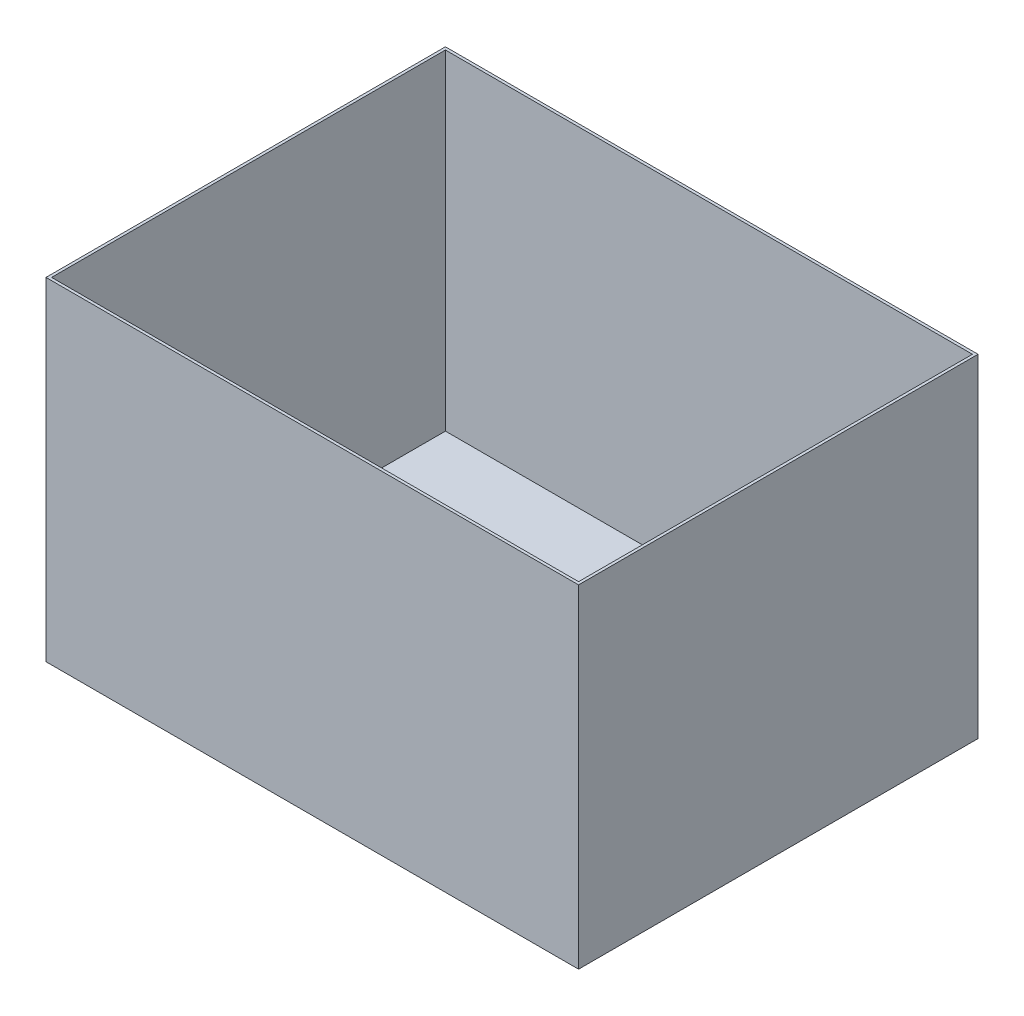
ISO-10303-21;
HEADER;
FILE_DESCRIPTION(('STEP AP214'),'2;1');
FILE_NAME('part.step','',(''),(''),'','','');
FILE_SCHEMA(('AUTOMOTIVE_DESIGN { 1 0 10303 214 1 1 1 1 }'));
ENDSEC;
DATA;
#1=APPLICATION_CONTEXT('core data for automotive mechanical design processes');
#2=APPLICATION_PROTOCOL_DEFINITION('international standard','automotive_design',2000,#1);
#3=PRODUCT_CONTEXT('',#1,'mechanical');
#4=PRODUCT('Part','Part','',(#3));
#5=PRODUCT_RELATED_PRODUCT_CATEGORY('part','',(#4));
#6=PRODUCT_DEFINITION_FORMATION('','',#4);
#7=PRODUCT_DEFINITION_CONTEXT('part definition',#1,'design');
#8=PRODUCT_DEFINITION('design','',#6,#7);
#9=PRODUCT_DEFINITION_SHAPE('','',#8);
#10=(LENGTH_UNIT() NAMED_UNIT(*) SI_UNIT(.MILLI.,.METRE.));
#11=(NAMED_UNIT(*) PLANE_ANGLE_UNIT() SI_UNIT($,.RADIAN.));
#12=(NAMED_UNIT(*) SI_UNIT($,.STERADIAN.) SOLID_ANGLE_UNIT());
#13=UNCERTAINTY_MEASURE_WITH_UNIT(LENGTH_MEASURE(1.E-05),#10,'distance_accuracy_value','');
#14=(GEOMETRIC_REPRESENTATION_CONTEXT(3) GLOBAL_UNCERTAINTY_ASSIGNED_CONTEXT((#13)) GLOBAL_UNIT_ASSIGNED_CONTEXT((#10,
#11,#12)) REPRESENTATION_CONTEXT('',''));
#15=CARTESIAN_POINT('',(0.,0.,0.));
#16=DIRECTION('',(0.,0.,1.));
#17=DIRECTION('',(1.,0.,0.));
#18=AXIS2_PLACEMENT_3D('',#15,#16,#17);
#19=CARTESIAN_POINT('',(609.6,762.,-457.2));
#20=DIRECTION('',(-1.,0.,0.));
#21=DIRECTION('',(0.,0.,1.));
#22=AXIS2_PLACEMENT_3D('',#19,#20,#21);
#23=PLANE('',#22);
#24=DIRECTION('',(0.,0.,-1.));
#25=VECTOR('',#24,1.);
#26=CARTESIAN_POINT('',(609.6,0.,-457.2));
#27=LINE('',#26,#25);
#28=CARTESIAN_POINT('',(609.6,0.,457.2));
#29=VERTEX_POINT('',#28);
#30=CARTESIAN_POINT('',(609.6,0.,-457.2));
#31=VERTEX_POINT('',#30);
#32=EDGE_CURVE('E167',#29,#31,#27,.T.);
#33=ORIENTED_EDGE('',*,*,#32,.T.);
#34=DIRECTION('',(0.,-1.,0.));
#35=VECTOR('',#34,1.);
#36=CARTESIAN_POINT('',(609.6,762.,-457.2));
#37=LINE('',#36,#35);
#38=CARTESIAN_POINT('',(609.6,762.,-457.2));
#39=VERTEX_POINT('',#38);
#40=EDGE_CURVE('E11',#39,#31,#37,.T.);
#41=ORIENTED_EDGE('',*,*,#40,.F.);
#42=DIRECTION('',(0.,0.,-1.));
#43=VECTOR('',#42,1.);
#44=CARTESIAN_POINT('',(609.6,762.,-457.2));
#45=LINE('',#44,#43);
#46=CARTESIAN_POINT('',(609.6,762.,457.2));
#47=VERTEX_POINT('',#46);
#48=EDGE_CURVE('E156',#47,#39,#45,.T.);
#49=ORIENTED_EDGE('',*,*,#48,.F.);
#50=DIRECTION('',(0.,-1.,0.));
#51=VECTOR('',#50,1.);
#52=CARTESIAN_POINT('',(609.6,762.,457.2));
#53=LINE('',#52,#51);
#54=EDGE_CURVE('E166',#47,#29,#53,.T.);
#55=ORIENTED_EDGE('',*,*,#54,.T.);
#56=EDGE_LOOP('',(#33,#41,#49,#55));
#57=FACE_BOUND('',#56,.T.);
#58=ADVANCED_FACE('F39',(#57),#23,.F.);
#59=CARTESIAN_POINT('',(-609.6,762.,-457.2));
#60=DIRECTION('',(0.,0.,1.));
#61=DIRECTION('',(1.,0.,0.));
#62=AXIS2_PLACEMENT_3D('',#59,#60,#61);
#63=PLANE('',#62);
#64=DIRECTION('',(-1.,0.,0.));
#65=VECTOR('',#64,1.);
#66=CARTESIAN_POINT('',(-609.6,0.,-457.2));
#67=LINE('',#66,#65);
#68=CARTESIAN_POINT('',(-609.6,0.,-457.2));
#69=VERTEX_POINT('',#68);
#70=EDGE_CURVE('E171',#31,#69,#67,.T.);
#71=ORIENTED_EDGE('',*,*,#70,.T.);
#72=DIRECTION('',(0.,-1.,0.));
#73=VECTOR('',#72,1.);
#74=CARTESIAN_POINT('',(-609.6,762.,-457.2));
#75=LINE('',#74,#73);
#76=CARTESIAN_POINT('',(-609.6,762.,-457.2));
#77=VERTEX_POINT('',#76);
#78=EDGE_CURVE('E47',#77,#69,#75,.T.);
#79=ORIENTED_EDGE('',*,*,#78,.F.);
#80=DIRECTION('',(-1.,0.,0.));
#81=VECTOR('',#80,1.);
#82=CARTESIAN_POINT('',(-609.6,762.,-457.2));
#83=LINE('',#82,#81);
#84=EDGE_CURVE('E91',#39,#77,#83,.T.);
#85=ORIENTED_EDGE('',*,*,#84,.F.);
#86=ORIENTED_EDGE('',*,*,#40,.T.);
#87=EDGE_LOOP('',(#71,#79,#85,#86));
#88=FACE_BOUND('',#87,.T.);
#89=ADVANCED_FACE('F206',(#88),#63,.F.);
#90=CARTESIAN_POINT('',(-609.6,762.,-457.2));
#91=DIRECTION('',(1.,0.,0.));
#92=DIRECTION('',(0.,0.,-1.));
#93=AXIS2_PLACEMENT_3D('',#90,#91,#92);
#94=PLANE('',#93);
#95=DIRECTION('',(0.,0.,1.));
#96=VECTOR('',#95,1.);
#97=CARTESIAN_POINT('',(-609.6,0.,-457.2));
#98=LINE('',#97,#96);
#99=CARTESIAN_POINT('',(-609.6,0.,457.2));
#100=VERTEX_POINT('',#99);
#101=EDGE_CURVE('E174',#69,#100,#98,.T.);
#102=ORIENTED_EDGE('',*,*,#101,.T.);
#103=DIRECTION('',(0.,-1.,0.));
#104=VECTOR('',#103,1.);
#105=CARTESIAN_POINT('',(-609.6,762.,457.2));
#106=LINE('',#105,#104);
#107=CARTESIAN_POINT('',(-609.6,762.,457.2));
#108=VERTEX_POINT('',#107);
#109=EDGE_CURVE('E181',#108,#100,#106,.T.);
#110=ORIENTED_EDGE('',*,*,#109,.F.);
#111=DIRECTION('',(0.,0.,1.));
#112=VECTOR('',#111,1.);
#113=CARTESIAN_POINT('',(-609.6,762.,-457.2));
#114=LINE('',#113,#112);
#115=EDGE_CURVE('E161',#77,#108,#114,.T.);
#116=ORIENTED_EDGE('',*,*,#115,.F.);
#117=ORIENTED_EDGE('',*,*,#78,.T.);
#118=EDGE_LOOP('',(#102,#110,#116,#117));
#119=FACE_BOUND('',#118,.T.);
#120=ADVANCED_FACE('F188',(#119),#94,.F.);
#121=CARTESIAN_POINT('',(-609.6,762.,457.2));
#122=DIRECTION('',(0.,0.,-1.));
#123=DIRECTION('',(-1.,0.,0.));
#124=AXIS2_PLACEMENT_3D('',#121,#122,#123);
#125=PLANE('',#124);
#126=DIRECTION('',(1.,0.,0.));
#127=VECTOR('',#126,1.);
#128=CARTESIAN_POINT('',(-609.6,0.,457.2));
#129=LINE('',#128,#127);
#130=EDGE_CURVE('E84',#100,#29,#129,.T.);
#131=ORIENTED_EDGE('',*,*,#130,.T.);
#132=ORIENTED_EDGE('',*,*,#54,.F.);
#133=DIRECTION('',(1.,0.,0.));
#134=VECTOR('',#133,1.);
#135=CARTESIAN_POINT('',(-609.6,762.,457.2));
#136=LINE('',#135,#134);
#137=EDGE_CURVE('E63',#108,#47,#136,.T.);
#138=ORIENTED_EDGE('',*,*,#137,.F.);
#139=ORIENTED_EDGE('',*,*,#109,.T.);
#140=EDGE_LOOP('',(#131,#132,#138,#139));
#141=FACE_BOUND('',#140,.T.);
#142=ADVANCED_FACE('F196',(#141),#125,.F.);
#143=CARTESIAN_POINT('',(0.,762.,0.));
#144=DIRECTION('',(0.,1.,0.));
#145=DIRECTION('',(0.,0.,1.));
#146=AXIS2_PLACEMENT_3D('',#143,#144,#145);
#147=PLANE('',#146);
#148=DIRECTION('',(0.,0.,-1.));
#149=VECTOR('',#148,1.);
#150=CARTESIAN_POINT('',(603.25,762.,-457.2));
#151=LINE('',#150,#149);
#152=CARTESIAN_POINT('',(603.25,762.,450.85));
#153=VERTEX_POINT('',#152);
#154=CARTESIAN_POINT('',(603.25,762.,-450.85));
#155=VERTEX_POINT('',#154);
#156=EDGE_CURVE('E140',#153,#155,#151,.T.);
#157=ORIENTED_EDGE('',*,*,#156,.F.);
#158=DIRECTION('',(1.,0.,0.));
#159=VECTOR('',#158,1.);
#160=CARTESIAN_POINT('',(-609.6,762.,450.85));
#161=LINE('',#160,#159);
#162=CARTESIAN_POINT('',(-603.25,762.,450.85));
#163=VERTEX_POINT('',#162);
#164=EDGE_CURVE('E153',#163,#153,#161,.T.);
#165=ORIENTED_EDGE('',*,*,#164,.F.);
#166=DIRECTION('',(0.,0.,1.));
#167=VECTOR('',#166,1.);
#168=CARTESIAN_POINT('',(-603.25,762.,-457.2));
#169=LINE('',#168,#167);
#170=CARTESIAN_POINT('',(-603.25,762.,-450.85));
#171=VERTEX_POINT('',#170);
#172=EDGE_CURVE('E150',#171,#163,#169,.T.);
#173=ORIENTED_EDGE('',*,*,#172,.F.);
#174=DIRECTION('',(-1.,0.,0.));
#175=VECTOR('',#174,1.);
#176=CARTESIAN_POINT('',(-609.6,762.,-450.85));
#177=LINE('',#176,#175);
#178=EDGE_CURVE('E129',#155,#171,#177,.T.);
#179=ORIENTED_EDGE('',*,*,#178,.F.);
#180=EDGE_LOOP('',(#157,#165,#173,#179));
#181=FACE_BOUND('',#180,.T.);
#182=ORIENTED_EDGE('',*,*,#48,.T.);
#183=ORIENTED_EDGE('',*,*,#84,.T.);
#184=ORIENTED_EDGE('',*,*,#115,.T.);
#185=ORIENTED_EDGE('',*,*,#137,.T.);
#186=EDGE_LOOP('',(#182,#183,#184,#185));
#187=FACE_BOUND('',#186,.T.);
#188=ADVANCED_FACE('F198',(#181,#187),#147,.T.);
#189=CARTESIAN_POINT('',(0.,0.,0.));
#190=DIRECTION('',(0.,1.,0.));
#191=DIRECTION('',(0.,0.,1.));
#192=AXIS2_PLACEMENT_3D('',#189,#190,#191);
#193=PLANE('',#192);
#194=ORIENTED_EDGE('',*,*,#32,.F.);
#195=ORIENTED_EDGE('',*,*,#130,.F.);
#196=ORIENTED_EDGE('',*,*,#101,.F.);
#197=ORIENTED_EDGE('',*,*,#70,.F.);
#198=EDGE_LOOP('',(#194,#195,#196,#197));
#199=FACE_BOUND('',#198,.T.);
#200=ADVANCED_FACE('F192',(#199),#193,.F.);
#201=CARTESIAN_POINT('',(603.25,762.,-457.2));
#202=DIRECTION('',(-1.,0.,0.));
#203=DIRECTION('',(0.,0.,1.));
#204=AXIS2_PLACEMENT_3D('',#201,#202,#203);
#205=PLANE('',#204);
#206=DIRECTION('',(0.,0.,-1.));
#207=VECTOR('',#206,1.);
#208=CARTESIAN_POINT('',(603.25,6.34999999999997,-457.2));
#209=LINE('',#208,#207);
#210=CARTESIAN_POINT('',(603.25,6.35,450.85));
#211=VERTEX_POINT('',#210);
#212=CARTESIAN_POINT('',(603.25,6.35,-450.85));
#213=VERTEX_POINT('',#212);
#214=EDGE_CURVE('E119',#211,#213,#209,.T.);
#215=ORIENTED_EDGE('',*,*,#214,.F.);
#216=DIRECTION('',(0.,-1.,0.));
#217=VECTOR('',#216,1.);
#218=CARTESIAN_POINT('',(603.25,762.,450.85));
#219=LINE('',#218,#217);
#220=EDGE_CURVE('E144',#153,#211,#219,.T.);
#221=ORIENTED_EDGE('',*,*,#220,.F.);
#222=ORIENTED_EDGE('',*,*,#156,.T.);
#223=DIRECTION('',(0.,-1.,0.));
#224=VECTOR('',#223,1.);
#225=CARTESIAN_POINT('',(603.25,762.,-450.85));
#226=LINE('',#225,#224);
#227=EDGE_CURVE('E133',#155,#213,#226,.T.);
#228=ORIENTED_EDGE('',*,*,#227,.T.);
#229=EDGE_LOOP('',(#215,#221,#222,#228));
#230=FACE_BOUND('',#229,.T.);
#231=ADVANCED_FACE('F233',(#230),#205,.T.);
#232=CARTESIAN_POINT('',(-609.6,762.,-450.85));
#233=DIRECTION('',(0.,0.,1.));
#234=DIRECTION('',(1.,0.,0.));
#235=AXIS2_PLACEMENT_3D('',#232,#233,#234);
#236=PLANE('',#235);
#237=DIRECTION('',(-1.,0.,0.));
#238=VECTOR('',#237,1.);
#239=CARTESIAN_POINT('',(-609.6,6.34999999999997,-450.85));
#240=LINE('',#239,#238);
#241=CARTESIAN_POINT('',(-603.25,6.35,-450.85));
#242=VERTEX_POINT('',#241);
#243=EDGE_CURVE('E113',#213,#242,#240,.T.);
#244=ORIENTED_EDGE('',*,*,#243,.F.);
#245=ORIENTED_EDGE('',*,*,#227,.F.);
#246=ORIENTED_EDGE('',*,*,#178,.T.);
#247=DIRECTION('',(0.,-1.,0.));
#248=VECTOR('',#247,1.);
#249=CARTESIAN_POINT('',(-603.25,762.,-450.85));
#250=LINE('',#249,#248);
#251=EDGE_CURVE('E126',#171,#242,#250,.T.);
#252=ORIENTED_EDGE('',*,*,#251,.T.);
#253=EDGE_LOOP('',(#244,#245,#246,#252));
#254=FACE_BOUND('',#253,.T.);
#255=ADVANCED_FACE('F127',(#254),#236,.T.);
#256=CARTESIAN_POINT('',(-603.25,762.,-457.2));
#257=DIRECTION('',(1.,0.,0.));
#258=DIRECTION('',(0.,0.,-1.));
#259=AXIS2_PLACEMENT_3D('',#256,#257,#258);
#260=PLANE('',#259);
#261=DIRECTION('',(0.,0.,1.));
#262=VECTOR('',#261,1.);
#263=CARTESIAN_POINT('',(-603.25,6.34999999999997,-457.2));
#264=LINE('',#263,#262);
#265=CARTESIAN_POINT('',(-603.25,6.35,450.85));
#266=VERTEX_POINT('',#265);
#267=EDGE_CURVE('E117',#242,#266,#264,.T.);
#268=ORIENTED_EDGE('',*,*,#267,.F.);
#269=ORIENTED_EDGE('',*,*,#251,.F.);
#270=ORIENTED_EDGE('',*,*,#172,.T.);
#271=DIRECTION('',(0.,-1.,0.));
#272=VECTOR('',#271,1.);
#273=CARTESIAN_POINT('',(-603.25,762.,450.85));
#274=LINE('',#273,#272);
#275=EDGE_CURVE('E54',#163,#266,#274,.T.);
#276=ORIENTED_EDGE('',*,*,#275,.T.);
#277=EDGE_LOOP('',(#268,#269,#270,#276));
#278=FACE_BOUND('',#277,.T.);
#279=ADVANCED_FACE('F135',(#278),#260,.T.);
#280=CARTESIAN_POINT('',(-609.6,762.,450.85));
#281=DIRECTION('',(0.,0.,-1.));
#282=DIRECTION('',(-1.,0.,0.));
#283=AXIS2_PLACEMENT_3D('',#280,#281,#282);
#284=PLANE('',#283);
#285=DIRECTION('',(1.,0.,0.));
#286=VECTOR('',#285,1.);
#287=CARTESIAN_POINT('',(-609.6,6.34999999999997,450.85));
#288=LINE('',#287,#286);
#289=EDGE_CURVE('E137',#266,#211,#288,.T.);
#290=ORIENTED_EDGE('',*,*,#289,.F.);
#291=ORIENTED_EDGE('',*,*,#275,.F.);
#292=ORIENTED_EDGE('',*,*,#164,.T.);
#293=ORIENTED_EDGE('',*,*,#220,.T.);
#294=EDGE_LOOP('',(#290,#291,#292,#293));
#295=FACE_BOUND('',#294,.T.);
#296=ADVANCED_FACE('F263',(#295),#284,.T.);
#297=CARTESIAN_POINT('',(0.,6.35,0.));
#298=DIRECTION('',(0.,1.,0.));
#299=DIRECTION('',(0.,0.,1.));
#300=AXIS2_PLACEMENT_3D('',#297,#298,#299);
#301=PLANE('',#300);
#302=ORIENTED_EDGE('',*,*,#214,.T.);
#303=ORIENTED_EDGE('',*,*,#243,.T.);
#304=ORIENTED_EDGE('',*,*,#267,.T.);
#305=ORIENTED_EDGE('',*,*,#289,.T.);
#306=EDGE_LOOP('',(#302,#303,#304,#305));
#307=FACE_BOUND('',#306,.T.);
#308=ADVANCED_FACE('F115',(#307),#301,.T.);
#309=CLOSED_SHELL('',(#58,#89,#120,#142,#188,#200,#231,#255,#279,#296,#308));
#310=MANIFOLD_SOLID_BREP('B2',#309);
#311=ADVANCED_BREP_SHAPE_REPRESENTATION('',(#18,#310),#14);
#312=SHAPE_DEFINITION_REPRESENTATION(#9,#311);
ENDSEC;
END-ISO-10303-21;
